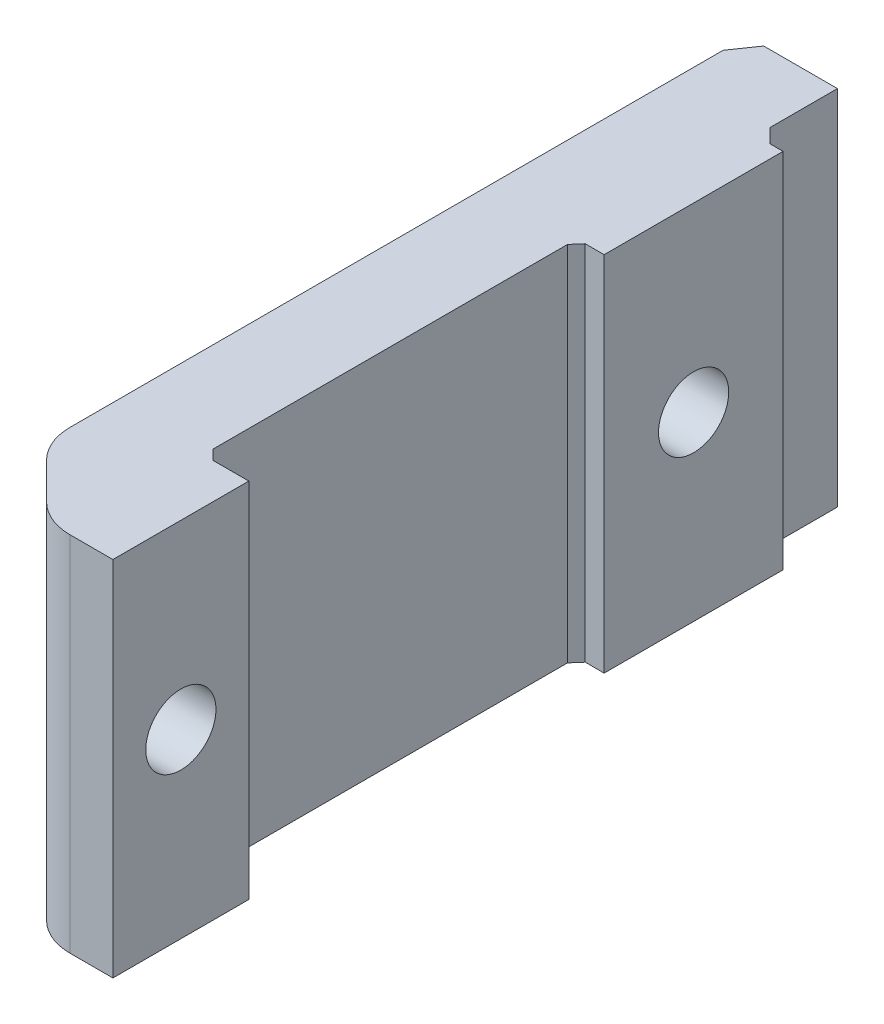
ISO-10303-21;
HEADER;
FILE_DESCRIPTION(('STEP AP214'),'2;1');
FILE_NAME('part.step','',(''),(''),'','','');
FILE_SCHEMA(('AUTOMOTIVE_DESIGN { 1 0 10303 214 1 1 1 1 }'));
ENDSEC;
DATA;
#1=APPLICATION_CONTEXT('core data for automotive mechanical design processes');
#2=APPLICATION_PROTOCOL_DEFINITION('international standard','automotive_design',2000,#1);
#3=PRODUCT_CONTEXT('',#1,'mechanical');
#4=PRODUCT('Part','Part','',(#3));
#5=PRODUCT_RELATED_PRODUCT_CATEGORY('part','',(#4));
#6=PRODUCT_DEFINITION_FORMATION('','',#4);
#7=PRODUCT_DEFINITION_CONTEXT('part definition',#1,'design');
#8=PRODUCT_DEFINITION('design','',#6,#7);
#9=PRODUCT_DEFINITION_SHAPE('','',#8);
#10=(LENGTH_UNIT() NAMED_UNIT(*) SI_UNIT(.MILLI.,.METRE.));
#11=(NAMED_UNIT(*) PLANE_ANGLE_UNIT() SI_UNIT($,.RADIAN.));
#12=(NAMED_UNIT(*) SI_UNIT($,.STERADIAN.) SOLID_ANGLE_UNIT());
#13=UNCERTAINTY_MEASURE_WITH_UNIT(LENGTH_MEASURE(1.E-05),#10,'distance_accuracy_value','');
#14=(GEOMETRIC_REPRESENTATION_CONTEXT(3) GLOBAL_UNCERTAINTY_ASSIGNED_CONTEXT((#13)) GLOBAL_UNIT_ASSIGNED_CONTEXT((#10,
#11,#12)) REPRESENTATION_CONTEXT('',''));
#15=CARTESIAN_POINT('',(0.,0.,0.));
#16=DIRECTION('',(0.,0.,1.));
#17=DIRECTION('',(1.,0.,0.));
#18=AXIS2_PLACEMENT_3D('',#15,#16,#17);
#19=CARTESIAN_POINT('',(-0.176864244741881,16.,3.99697087418127));
#20=DIRECTION('',(0.,-1.,0.));
#21=DIRECTION('',(0.,0.,-1.));
#22=AXIS2_PLACEMENT_3D('',#19,#20,#21);
#23=CYLINDRICAL_SURFACE('',#22,2.5);
#24=CARTESIAN_POINT('',(-2.63714928671423,8.,3.55312685625707));
#25=CARTESIAN_POINT('',(-2.63715455179953,7.91328528262915,3.55313134936422));
#26=CARTESIAN_POINT('',(-2.63850190324259,7.82649718349841,3.56043177872537));
#27=CARTESIAN_POINT('',(-2.64346503827495,7.65534506039806,3.58943311872725));
#28=CARTESIAN_POINT('',(-2.64708415723435,7.57098479172109,3.61115520570759));
#29=CARTESIAN_POINT('',(-2.65533723190511,7.40722009076834,3.66833668628013));
#30=CARTESIAN_POINT('',(-2.65996997230687,7.32780986876128,3.70377966764607));
#31=CARTESIAN_POINT('',(-2.66842184803655,7.17598969620337,3.78744471572229));
#32=CARTESIAN_POINT('',(-2.67224105346486,7.10357914280162,3.83566568057995));
#33=CARTESIAN_POINT('',(-2.67688973496471,6.96737987700647,3.94390282603817));
#34=CARTESIAN_POINT('',(-2.67770259997984,6.9036409367615,4.00398261488679));
#35=CARTESIAN_POINT('',(-2.6739528444265,6.78725865258344,4.13392506582161));
#36=CARTESIAN_POINT('',(-2.66939343883689,6.73460869478206,4.20378185492782));
#37=CARTESIAN_POINT('',(-2.653278232286,6.64468528703496,4.34659638258143));
#38=CARTESIAN_POINT('',(-2.64212930992112,6.60671487585939,4.41916025811655));
#39=CARTESIAN_POINT('',(-2.61197069557599,6.54308180535848,4.56793757943773));
#40=CARTESIAN_POINT('',(-2.59296468314763,6.5174133970193,4.64414930214883));
#41=CARTESIAN_POINT('',(-2.54820820858339,6.47972137957398,4.79215250402136));
#42=CARTESIAN_POINT('',(-2.52298175583215,6.46691337261618,4.86390611522359));
#43=CARTESIAN_POINT('',(-2.46560544897194,6.4514210654967,5.00569143598688));
#44=CARTESIAN_POINT('',(-2.43345417722126,6.44873884036075,5.07572278969351));
#45=CARTESIAN_POINT('',(-2.36113667132257,6.45243134532187,5.21577354737119));
#46=CARTESIAN_POINT('',(-2.32064542639852,6.45927470671808,5.28561038193112));
#47=CARTESIAN_POINT('',(-2.23382332039923,6.48122761164427,5.42011699716647));
#48=CARTESIAN_POINT('',(-2.18748959854607,6.49634121690236,5.48478422101388));
#49=CARTESIAN_POINT('',(-2.06315578751737,6.54333340622405,5.64219021543526));
#50=CARTESIAN_POINT('',(-1.98173709350291,6.57986071849479,5.73084681557743));
#51=CARTESIAN_POINT('',(-1.8100011631044,6.66352630637584,5.89353420707895));
#52=CARTESIAN_POINT('',(-1.71965652403016,6.71069786713301,5.96751772111174));
#53=CARTESIAN_POINT('',(-1.56291627536124,6.79446472892987,6.07899287614943));
#54=CARTESIAN_POINT('',(-1.4984255193106,6.82943078839074,6.12048054508538));
#55=CARTESIAN_POINT('',(-1.36643622736506,6.90074003026494,6.19714132233396));
#56=CARTESIAN_POINT('',(-1.29893551219178,6.93708420752134,6.23230975959076));
#57=CARTESIAN_POINT('',(-1.16097341571144,7.00956297040544,6.2963871043687));
#58=CARTESIAN_POINT('',(-1.090513508727,7.04569765043128,6.32529908581155));
#59=CARTESIAN_POINT('',(-0.946307508055552,7.11568460725738,6.37684821734745));
#60=CARTESIAN_POINT('',(-0.872565242341472,7.1495394327493,6.39949246543049));
#61=CARTESIAN_POINT('',(-0.728028447186261,7.20895895477479,6.43649204052778));
#62=CARTESIAN_POINT('',(-0.657582348345416,7.23499890769026,6.45141651884273));
#63=CARTESIAN_POINT('',(-0.513335310401748,7.27869098888067,6.4752934391704));
#64=CARTESIAN_POINT('',(-0.439552240226529,7.29638306644996,6.48427440916587));
#65=CARTESIAN_POINT('',(-0.300607137612723,7.31729829423222,6.49472522378213));
#66=CARTESIAN_POINT('',(-0.235799057201005,7.32228482770957,6.49711499460251));
#67=CARTESIAN_POINT('',(-0.106242422703102,7.32166518569311,6.49681309517796));
#68=CARTESIAN_POINT('',(-0.0414938780388344,7.31605755199565,6.49412072541647));
#69=CARTESIAN_POINT('',(0.107859810153625,7.29225719405487,6.48219058099686));
#70=CARTESIAN_POINT('',(0.191691048864391,7.2704192671506,6.47103080478403));
#71=CARTESIAN_POINT('',(0.35503014155456,7.21700191968655,6.44116177137173));
#72=CARTESIAN_POINT('',(0.434507279422327,7.18536172796506,6.42240518679231));
#73=CARTESIAN_POINT('',(0.584646140293019,7.1195587131712,6.37936576684948));
#74=CARTESIAN_POINT('',(0.655549708966023,7.08566864727152,6.35549122542122));
#75=CARTESIAN_POINT('',(0.794347269254775,7.01634321677795,6.30181145441928));
#76=CARTESIAN_POINT('',(0.86223881248401,6.98090663985665,6.27200150435516));
#77=CARTESIAN_POINT('',(0.995100834569794,6.91031649542325,6.20648902015249));
#78=CARTESIAN_POINT('',(1.06007610532625,6.875162547862,6.17079663924867));
#79=CARTESIAN_POINT('',(1.1871960806527,6.80643142612682,6.09336705738661));
#80=CARTESIAN_POINT('',(1.2493407720642,6.77285425928284,6.05162982833149));
#81=CARTESIAN_POINT('',(1.3981779164835,6.69384311531685,5.94152375883796));
#82=CARTESIAN_POINT('',(1.48317962869637,6.64996237006495,5.86967622374105));
#83=CARTESIAN_POINT('',(1.64499058479485,6.57218394283925,5.71263306397279));
#84=CARTESIAN_POINT('',(1.72181448497113,6.5382682026992,5.62746201839206));
#85=CARTESIAN_POINT('',(1.84834198594058,6.49116686584974,5.46548588451408));
#86=CARTESIAN_POINT('',(1.90021947498909,6.47500760598496,5.39126141047408));
#87=CARTESIAN_POINT('',(1.99617998203817,6.45376686443383,5.23638731915835));
#88=CARTESIAN_POINT('',(2.04026741100954,6.44867909514209,5.15574137568772));
#89=CARTESIAN_POINT('',(2.11955430297112,6.45192233858672,4.98944768840343));
#90=CARTESIAN_POINT('',(2.1546702779165,6.4603744281823,4.90376148811728));
#91=CARTESIAN_POINT('',(2.21448283262022,6.49263893737719,4.73163980072135));
#92=CARTESIAN_POINT('',(2.23918828730509,6.5164382295676,4.64520501620006));
#93=CARTESIAN_POINT('',(2.27559378917474,6.57520085898834,4.48792412728493));
#94=CARTESIAN_POINT('',(2.28864267178575,6.60809832938734,4.41660764306658));
#95=CARTESIAN_POINT('',(2.30813123330981,6.68480735170055,4.27913610641269));
#96=CARTESIAN_POINT('',(2.31457076940588,6.72861913942956,4.21298116553804));
#97=CARTESIAN_POINT('',(2.32218393364724,6.82497014443009,4.08930902827821));
#98=CARTESIAN_POINT('',(2.3234651744049,6.87730704307425,4.0316397680065));
#99=CARTESIAN_POINT('',(2.32266571000175,6.99000769576953,3.9248020459077));
#100=CARTESIAN_POINT('',(2.32058407620881,7.05037366276211,3.87563593631155));
#101=CARTESIAN_POINT('',(2.31447000919855,7.18257066455031,3.78355107347874));
#102=CARTESIAN_POINT('',(2.3103013774049,7.25492431648245,3.74139077823713));
#103=CARTESIAN_POINT('',(2.30182950161697,7.40546943588939,3.66924938751529));
#104=CARTESIAN_POINT('',(2.29752622752948,7.48366221393095,3.63927103600471));
#105=CARTESIAN_POINT('',(2.29011798692447,7.64747345201231,3.59123269171699));
#106=CARTESIAN_POINT('',(2.28707434882282,7.73326735234245,3.57375765285728));
#107=CARTESIAN_POINT('',(2.28350733033281,7.90661648983552,3.55348382306791));
#108=CARTESIAN_POINT('',(2.28298363032531,7.99417150221119,3.55068317089221));
#109=CARTESIAN_POINT('',(2.28461563090622,8.16734082170265,3.55978065331479));
#110=CARTESIAN_POINT('',(2.28673658980165,8.25296556144274,3.57148818802031));
#111=CARTESIAN_POINT('',(2.29290756182516,8.42102849088298,3.60892150697921));
#112=CARTESIAN_POINT('',(2.29695792590518,8.50346609790438,3.63464984168894));
#113=CARTESIAN_POINT('',(2.30559648736327,8.66328371010211,3.69954971816812));
#114=CARTESIAN_POINT('',(2.31018710229541,8.74063836590985,3.73878332563916));
#115=CARTESIAN_POINT('',(2.31794454880559,8.88780520768157,3.82963575835757));
#116=CARTESIAN_POINT('',(2.3211111905281,8.95761638694664,3.88125623371525));
#117=CARTESIAN_POINT('',(2.3237927251222,9.08801383495477,3.99574929065397));
#118=CARTESIAN_POINT('',(2.32329063021959,9.14855586285779,4.05867289888653));
#119=CARTESIAN_POINT('',(2.31630377451473,9.25807971948864,4.19358357912063));
#120=CARTESIAN_POINT('',(2.30982338187868,9.30706995595837,4.2655640004162));
#121=CARTESIAN_POINT('',(2.28964386326624,9.38919878992777,4.41092957434017));
#122=CARTESIAN_POINT('',(2.2764426910829,9.42316235431137,4.4839174893908));
#123=CARTESIAN_POINT('',(2.2421804870686,9.4789898721573,4.63260576969309));
#124=CARTESIAN_POINT('',(2.22112203619387,9.50085779294352,4.70830523688182));
#125=CARTESIAN_POINT('',(2.17236634126112,9.53180831345552,4.8553340406442));
#126=CARTESIAN_POINT('',(2.14509833394841,9.54152842043381,4.92667456606537));
#127=CARTESIAN_POINT('',(2.08383697775448,9.5511787867001,5.0670652941571));
#128=CARTESIAN_POINT('',(2.04984192349535,9.55110656034449,5.13611491086428));
#129=CARTESIAN_POINT('',(1.97321862984303,9.54210689228929,5.27521154140888));
#130=CARTESIAN_POINT('',(1.9301429050739,9.53253719160407,5.34496727640181));
#131=CARTESIAN_POINT('',(1.83824712070816,9.50532843916963,5.47884000990264));
#132=CARTESIAN_POINT('',(1.78942434059765,9.48768555427235,5.54295431259778));
#133=CARTESIAN_POINT('',(1.65713207087965,9.43385919082603,5.70060025967102));
#134=CARTESIAN_POINT('',(1.57006433625943,9.39286375872222,5.78947732377105));
#135=CARTESIAN_POINT('',(1.38683265786381,9.30061632783018,5.95143113373885));
#136=CARTESIAN_POINT('',(1.29063709408622,9.24932793429498,6.02444984264055));
#137=CARTESIAN_POINT('',(1.12699850513044,9.1610755247512,6.13139040474614));
#138=CARTESIAN_POINT('',(1.06168481332529,9.12560913089346,6.16991947142806));
#139=CARTESIAN_POINT('',(0.928093373429657,9.05391036960556,6.24080577499284));
#140=CARTESIAN_POINT('',(0.859813184404775,9.01767738447255,6.27315780644302));
#141=CARTESIAN_POINT('',(0.720280779386887,8.94619910555417,6.3316765581952));
#142=CARTESIAN_POINT('',(0.649032579038887,8.91095257862372,6.35785133563644));
#143=CARTESIAN_POINT('',(0.503086853620424,8.84381525285675,6.40394339284877));
#144=CARTESIAN_POINT('',(0.428394664534766,8.81191949823402,6.4238700028226));
#145=CARTESIAN_POINT('',(0.282934643708923,8.758234583528,6.45532731851368));
#146=CARTESIAN_POINT('',(0.212586380875185,8.73573354663375,6.46752279764581));
#147=CARTESIAN_POINT('',(0.0690032859084441,8.70061829921416,6.48589184736848));
#148=CARTESIAN_POINT('',(-0.00420894252811168,8.68793859246591,6.49210537898861));
#149=CARTESIAN_POINT('',(-0.153032770257191,8.67599476754823,6.4979741850727));
#150=CARTESIAN_POINT('',(-0.228662963988012,8.67690134180384,6.49754601357715));
#151=CARTESIAN_POINT('',(-0.378393635668834,8.69224318245107,6.48997414115978));
#152=CARTESIAN_POINT('',(-0.452485525621528,8.7067403635534,6.48279970583651));
#153=CARTESIAN_POINT('',(-0.57671827680571,8.7396571404344,6.46534689789265));
#154=CARTESIAN_POINT('',(-0.627723558618165,8.75581931160735,6.45651344740599));
#155=CARTESIAN_POINT('',(-0.727999642733378,8.7914387821591,6.43600019401252));
#156=CARTESIAN_POINT('',(-0.777269305035178,8.81089820024848,6.42431855881687));
#157=CARTESIAN_POINT('',(-0.923019920386962,8.87249352259133,6.38515646726799));
#158=CARTESIAN_POINT('',(-1.01709410414285,8.9177360712699,6.35361037098929));
#159=CARTESIAN_POINT('',(-1.17855797798075,8.99942899004714,6.28875714810822));
#160=CARTESIAN_POINT('',(-1.24704789659902,9.03546456097367,6.25758258626855));
#161=CARTESIAN_POINT('',(-1.38115104631696,9.1070893431979,6.18908688401362));
#162=CARTESIAN_POINT('',(-1.44676281479583,9.14267832113489,6.15176266324788));
#163=CARTESIAN_POINT('',(-1.63882080298436,9.24644183364527,6.03057008851518));
#164=CARTESIAN_POINT('',(-1.76110644150534,9.31195111631515,5.93723644588269));
#165=CARTESIAN_POINT('',(-1.94788417824021,9.40399689149441,5.76421084700346));
#166=CARTESIAN_POINT('',(-2.01697585440771,9.43597250817663,5.69232175134394));
#167=CARTESIAN_POINT('',(-2.14760033030577,9.489817174772,5.53850738203536));
#168=CARTESIAN_POINT('',(-2.20914283030737,9.51169929627452,5.45659526374465));
#169=CARTESIAN_POINT('',(-2.3127020339601,9.53926422630262,5.29907221337233));
#170=CARTESIAN_POINT('',(-2.35625192856219,9.54710783172076,5.22485683531669));
#171=CARTESIAN_POINT('',(-2.43555643443657,9.55156768313379,5.07200633149812));
#172=CARTESIAN_POINT('',(-2.47131574052475,9.54819071100063,4.99337390370785));
#173=CARTESIAN_POINT('',(-2.53426886544373,9.52852737254085,4.83366219489505));
#174=CARTESIAN_POINT('',(-2.56140680615498,9.51215910300892,4.75257053972781));
#175=CARTESIAN_POINT('',(-2.60650305437225,9.46561813520866,4.59179992887169));
#176=CARTESIAN_POINT('',(-2.62446424719875,9.43544978157508,4.51212053675951));
#177=CARTESIAN_POINT('',(-2.65048224009456,9.36562162176151,4.36594687705191));
#178=CARTESIAN_POINT('',(-2.65938904851121,9.32731198278262,4.29895146173425));
#179=CARTESIAN_POINT('',(-2.67162108160679,9.24086916255082,4.17108636421261));
#180=CARTESIAN_POINT('',(-2.67494599284704,9.19273542981858,4.11021702618489));
#181=CARTESIAN_POINT('',(-2.67754030874978,9.08682538979567,3.99517851681801));
#182=CARTESIAN_POINT('',(-2.67672672061132,9.02887446710486,3.94116890290625));
#183=CARTESIAN_POINT('',(-2.67258336088419,8.90546269634765,3.84261917641333));
#184=CARTESIAN_POINT('',(-2.66925201056391,8.83999715818738,3.79808502776773));
#185=CARTESIAN_POINT('',(-2.66143893475333,8.69771291416108,3.716424609568));
#186=CARTESIAN_POINT('',(-2.6568874559157,8.62040643825996,3.68015377301865));
#187=CARTESIAN_POINT('',(-2.64858584674796,8.46092156701254,3.62080653313048));
#188=CARTESIAN_POINT('',(-2.6448346990483,8.37874952860797,3.59771331526514));
#189=CARTESIAN_POINT('',(-2.64050954268608,8.24666535030124,3.57207703261483));
#190=CARTESIAN_POINT('',(-2.63926291565544,8.19761715892374,3.56497924667656));
#191=CARTESIAN_POINT('',(-2.63758128549682,8.09905396017267,3.55550288532631));
#192=CARTESIAN_POINT('',(-2.63714627884163,8.04953895482877,3.55312428940522));
#193=CARTESIAN_POINT('',(-2.63714928671423,8.,3.55312685625707));
#194=B_SPLINE_CURVE_WITH_KNOTS('',3,(#24,#25,#26,#27,#28,#29,#30,#31,#32,#33,#34,#35,#36,#37,
#38,#39,#40,#41,#42,#43,#44,#45,#46,#47,#48,#49,#50,#51,#52,#53,#54,#55,#56,#57,#58,#59,#60,#61,
#62,#63,#64,#65,#66,#67,#68,#69,#70,#71,#72,#73,#74,#75,#76,#77,#78,#79,#80,#81,#82,#83,#84,#85,
#86,#87,#88,#89,#90,#91,#92,#93,#94,#95,#96,#97,#98,#99,#100,#101,#102,#103,#104,#105,#106,#107,
#108,#109,#110,#111,#112,#113,#114,#115,#116,#117,#118,#119,#120,#121,#122,#123,#124,#125,#126,
#127,#128,#129,#130,#131,#132,#133,#134,#135,#136,#137,#138,#139,#140,#141,#142,#143,#144,#145,
#146,#147,#148,#149,#150,#151,#152,#153,#154,#155,#156,#157,#158,#159,#160,#161,#162,#163,#164,
#165,#166,#167,#168,#169,#170,#171,#172,#173,#174,#175,#176,#177,#178,#179,#180,#181,#182,#183,
#184,#185,#186,#187,#188,#189,#190,#191,#192,#193),.UNSPECIFIED.,.T.,.F.,(4,2,2,2,2,2,2,2,2,2,2,
2,2,2,2,2,2,2,2,2,2,2,2,2,2,2,2,2,2,2,2,2,2,2,2,2,2,2,2,2,2,2,2,2,2,2,2,2,2,2,2,2,2,2,2,2,2,2,2,
2,2,2,2,2,2,2,2,2,2,2,2,2,2,2,2,2,2,2,2,2,2,2,2,2,4),(0.,0.259959557600944,0.520301678940626,
0.780333349888979,1.04034260545439,1.30178637267187,1.56307376104617,1.80970183385275,
2.05621453893334,2.28656178082926,2.51695622406966,2.75909461357363,3.00135203030078,
3.37662391035488,3.75308596096088,4.00563803418962,4.25837602795112,4.51098956312534,
4.7633158407746,4.99253609624558,5.22064798996372,5.41476389639609,5.60890652330025,
5.86937921990535,6.13150022787713,6.37758493537446,6.62386614395025,6.86972663283107,
7.11558826452544,7.47327442301166,7.83030834222563,8.10523331186111,8.38000210818563,
8.65724170269237,8.93424447106099,9.17190228316004,9.40956523054051,9.64224351771494,
9.87498606820603,10.1254115469431,10.3758934025225,10.6374396019118,10.8989526269255,
11.1570661797426,11.4152267004358,11.6745898397832,11.9339875492591,12.194587136464,
12.4549964619058,12.6984353676694,12.9417943790014,13.1717577403224,13.4017794746595,
13.6484943122814,13.8953264118561,14.2861331539039,14.6783468946827,14.9292349929606,
15.1803335922289,15.4311028448055,15.681495827859,15.9054248949238,16.1278474563225,
16.3530667603552,16.5793171076701,16.741794223959,16.9043761417967,17.2306364318654,
17.4806872536758,17.7308637082993,18.2290064171271,18.5421824889704,18.8549518352414,
19.1131307710921,19.3711536884231,19.6308163491683,19.8903973173819,20.1223793982302,
20.3543745050663,20.5910401243554,20.8278542651388,21.0832498280305,21.3383187754798,
21.4868308290173,21.6353422371352),.UNSPECIFIED.);
#195=CARTESIAN_POINT('',(-2.67686424474188,6.91421966157149,3.99697087418127));
#196=VERTEX_POINT('',#195);
#197=CARTESIAN_POINT('',(-1.94463119770825,6.59829713448347,5.76473782714764));
#198=VERTEX_POINT('',#197);
#199=EDGE_CURVE('E308',#196,#198,#194,.T.);
#200=ORIENTED_EDGE('',*,*,#199,.F.);
#201=DIRECTION('',(0.,-1.,0.));
#202=VECTOR('',#201,1.);
#203=CARTESIAN_POINT('',(-2.67686424474188,16.,3.99697087418127));
#204=LINE('',#203,#202);
#205=CARTESIAN_POINT('',(-2.67686424474188,0.,3.99697087418127));
#206=VERTEX_POINT('',#205);
#207=EDGE_CURVE('E127',#196,#206,#204,.T.);
#208=ORIENTED_EDGE('',*,*,#207,.T.);
#209=CARTESIAN_POINT('',(-0.176864244741881,0.,3.99697087418127));
#210=DIRECTION('',(0.,1.,0.));
#211=DIRECTION('',(0.,0.,1.));
#212=AXIS2_PLACEMENT_3D('',#209,#210,#211);
#213=CIRCLE('',#212,2.5);
#214=CARTESIAN_POINT('',(-1.94463119770825,0.,5.76473782714764));
#215=VERTEX_POINT('',#214);
#216=EDGE_CURVE('E211',#215,#206,#213,.F.);
#217=ORIENTED_EDGE('',*,*,#216,.F.);
#218=DIRECTION('',(0.,-1.,0.));
#219=VECTOR('',#218,1.);
#220=CARTESIAN_POINT('',(-1.94463119770825,16.,5.76473782714764));
#221=LINE('',#220,#219);
#222=EDGE_CURVE('E292',#198,#215,#221,.T.);
#223=ORIENTED_EDGE('',*,*,#222,.F.);
#224=EDGE_LOOP('',(#200,#208,#217,#223));
#225=FACE_BOUND('',#224,.T.);
#226=ADVANCED_FACE('F38',(#225),#23,.T.);
#227=CARTESIAN_POINT('',(-1.94463119770831,9.40170286551665,5.76473782714774));
#228=VERTEX_POINT('',#227);
#229=CARTESIAN_POINT('',(-2.67686424474188,9.08578033842851,3.99697087418127));
#230=VERTEX_POINT('',#229);
#231=EDGE_CURVE('E54',#228,#230,#194,.T.);
#232=ORIENTED_EDGE('',*,*,#231,.F.);
#233=CARTESIAN_POINT('',(-1.94463119770825,16.,5.76473782714764));
#234=VERTEX_POINT('',#233);
#235=EDGE_CURVE('E48',#234,#228,#221,.T.);
#236=ORIENTED_EDGE('',*,*,#235,.F.);
#237=CARTESIAN_POINT('',(-0.176864244741881,16.,3.99697087418127));
#238=DIRECTION('',(0.,1.,0.));
#239=DIRECTION('',(0.,0.,1.));
#240=AXIS2_PLACEMENT_3D('',#237,#238,#239);
#241=CIRCLE('',#240,2.5);
#242=CARTESIAN_POINT('',(-2.67686424474188,16.,3.99697087418127));
#243=VERTEX_POINT('',#242);
#244=EDGE_CURVE('E256',#234,#243,#241,.F.);
#245=ORIENTED_EDGE('',*,*,#244,.T.);
#246=EDGE_CURVE('E62',#243,#230,#204,.T.);
#247=ORIENTED_EDGE('',*,*,#246,.T.);
#248=EDGE_LOOP('',(#232,#236,#245,#247));
#249=FACE_BOUND('',#248,.T.);
#250=ADVANCED_FACE('F40',(#249),#23,.T.);
#251=CARTESIAN_POINT('',(-3.85468451242794,16.,3.85468451242795));
#252=DIRECTION('',(0.707106781186547,0.,-0.707106781186548));
#253=DIRECTION('',(-0.707106781186548,0.,-0.707106781186547));
#254=AXIS2_PLACEMENT_3D('',#251,#252,#253);
#255=PLANE('',#254);
#256=ORIENTED_EDGE('',*,*,#235,.T.);
#257=CARTESIAN_POINT('',(-2.60624216859882,8.,5.10312685625707));
#258=DIRECTION('',(0.707106781186547,0.,-0.707106781186548));
#259=DIRECTION('',(0.707106781186548,0.,0.707106781186547));
#260=AXIS2_PLACEMENT_3D('',#257,#258,#259);
#261=ELLIPSE('',#260,2.1920310216783,1.55);
#262=EDGE_CURVE('E300',#228,#198,#261,.T.);
#263=ORIENTED_EDGE('',*,*,#262,.T.);
#264=ORIENTED_EDGE('',*,*,#222,.T.);
#265=DIRECTION('',(0.707106781186548,0.,0.707106781186547));
#266=VECTOR('',#265,1.);
#267=CARTESIAN_POINT('',(-3.85468451242794,0.,3.85468451242795));
#268=LINE('',#267,#266);
#269=CARTESIAN_POINT('',(-0.338475215632805,0.,7.37089380922308));
#270=VERTEX_POINT('',#269);
#271=EDGE_CURVE('E213',#215,#270,#268,.T.);
#272=ORIENTED_EDGE('',*,*,#271,.T.);
#273=DIRECTION('',(0.,-1.,0.));
#274=VECTOR('',#273,1.);
#275=CARTESIAN_POINT('',(-0.338475215632805,16.,7.37089380922308));
#276=LINE('',#275,#274);
#277=CARTESIAN_POINT('',(-0.338475215632805,16.,7.37089380922308));
#278=VERTEX_POINT('',#277);
#279=EDGE_CURVE('E290',#278,#270,#276,.T.);
#280=ORIENTED_EDGE('',*,*,#279,.F.);
#281=DIRECTION('',(0.707106781186548,0.,0.707106781186547));
#282=VECTOR('',#281,1.);
#283=CARTESIAN_POINT('',(-3.85468451242794,16.,3.85468451242795));
#284=LINE('',#283,#282);
#285=EDGE_CURVE('E402',#234,#278,#284,.T.);
#286=ORIENTED_EDGE('',*,*,#285,.F.);
#287=EDGE_LOOP('',(#256,#263,#264,#272,#280,#286));
#288=FACE_BOUND('',#287,.T.);
#289=ADVANCED_FACE('F298',(#288),#255,.F.);
#290=CARTESIAN_POINT('',(1.42929173733356,16.,5.60312685625671));
#291=DIRECTION('',(0.,-1.,0.));
#292=DIRECTION('',(0.,0.,-1.));
#293=AXIS2_PLACEMENT_3D('',#290,#291,#292);
#294=CYLINDRICAL_SURFACE('',#293,2.5);
#295=CARTESIAN_POINT('',(1.42929173733356,0.,5.60312685625671));
#296=DIRECTION('',(0.,1.,0.));
#297=DIRECTION('',(0.,0.,1.));
#298=AXIS2_PLACEMENT_3D('',#295,#296,#297);
#299=CIRCLE('',#298,2.5);
#300=CARTESIAN_POINT('',(1.42929173733356,0.,8.10312685625671));
#301=VERTEX_POINT('',#300);
#302=EDGE_CURVE('E217',#301,#270,#299,.F.);
#303=ORIENTED_EDGE('',*,*,#302,.F.);
#304=DIRECTION('',(0.,-1.,0.));
#305=VECTOR('',#304,1.);
#306=CARTESIAN_POINT('',(1.42929173733356,16.,8.10312685625671));
#307=LINE('',#306,#305);
#308=CARTESIAN_POINT('',(1.42929173733356,16.,8.10312685625671));
#309=VERTEX_POINT('',#308);
#310=EDGE_CURVE('E288',#309,#301,#307,.T.);
#311=ORIENTED_EDGE('',*,*,#310,.F.);
#312=CARTESIAN_POINT('',(1.42929173733356,16.,5.60312685625671));
#313=DIRECTION('',(0.,1.,0.));
#314=DIRECTION('',(0.,0.,1.));
#315=AXIS2_PLACEMENT_3D('',#312,#313,#314);
#316=CIRCLE('',#315,2.5);
#317=EDGE_CURVE('E401',#309,#278,#316,.F.);
#318=ORIENTED_EDGE('',*,*,#317,.T.);
#319=ORIENTED_EDGE('',*,*,#279,.T.);
#320=EDGE_LOOP('',(#303,#311,#318,#319));
#321=FACE_BOUND('',#320,.T.);
#322=ADVANCED_FACE('F316',(#321),#294,.T.);
#323=CARTESIAN_POINT('',(-1.52157214212552E-12,16.,8.10312685625644));
#324=DIRECTION('',(1.87775925160385E-13,0.,-1.));
#325=DIRECTION('',(-1.,0.,-1.87775925160385E-13));
#326=AXIS2_PLACEMENT_3D('',#323,#324,#325);
#327=PLANE('',#326);
#328=DIRECTION('',(1.,0.,1.87775925160385E-13));
#329=VECTOR('',#328,1.);
#330=CARTESIAN_POINT('',(-1.52157214212552E-12,0.,8.10312685625644));
#331=LINE('',#330,#329);
#332=CARTESIAN_POINT('',(3.32313575525812,0.,8.10312685625707));
#333=VERTEX_POINT('',#332);
#334=EDGE_CURVE('E220',#301,#333,#331,.T.);
#335=ORIENTED_EDGE('',*,*,#334,.T.);
#336=DIRECTION('',(0.,-1.,0.));
#337=VECTOR('',#336,1.);
#338=CARTESIAN_POINT('',(3.32313575525812,16.,8.10312685625707));
#339=LINE('',#338,#337);
#340=CARTESIAN_POINT('',(3.32313575525812,16.,8.10312685625707));
#341=VERTEX_POINT('',#340);
#342=EDGE_CURVE('E285',#341,#333,#339,.T.);
#343=ORIENTED_EDGE('',*,*,#342,.F.);
#344=DIRECTION('',(1.,0.,1.87775925160385E-13));
#345=VECTOR('',#344,1.);
#346=CARTESIAN_POINT('',(-1.52157214212552E-12,16.,8.10312685625644));
#347=LINE('',#346,#345);
#348=EDGE_CURVE('E407',#309,#341,#347,.T.);
#349=ORIENTED_EDGE('',*,*,#348,.F.);
#350=ORIENTED_EDGE('',*,*,#310,.T.);
#351=EDGE_LOOP('',(#335,#343,#349,#350));
#352=FACE_BOUND('',#351,.T.);
#353=ADVANCED_FACE('F389',(#352),#327,.F.);
#354=CARTESIAN_POINT('',(3.32313575525812,16.,0.));
#355=DIRECTION('',(-1.,0.,0.));
#356=DIRECTION('',(0.,0.,1.));
#357=AXIS2_PLACEMENT_3D('',#354,#355,#356);
#358=PLANE('',#357);
#359=CARTESIAN_POINT('',(3.32313575525812,8.,5.10312685625707));
#360=DIRECTION('',(1.,0.,0.));
#361=DIRECTION('',(0.,0.,-1.));
#362=AXIS2_PLACEMENT_3D('',#359,#360,#361);
#363=CIRCLE('',#362,1.55);
#364=CARTESIAN_POINT('',(3.32313575525812,8.,3.55312685625707));
#365=VERTEX_POINT('',#364);
#366=EDGE_CURVE('E317',#365,#365,#363,.T.);
#367=ORIENTED_EDGE('',*,*,#366,.F.);
#368=EDGE_LOOP('',(#367));
#369=FACE_BOUND('',#368,.T.);
#370=DIRECTION('',(0.,0.,-1.));
#371=VECTOR('',#370,1.);
#372=CARTESIAN_POINT('',(3.32313575525812,0.,0.));
#373=LINE('',#372,#371);
#374=CARTESIAN_POINT('',(3.32313575525812,0.,2.10312685625707));
#375=VERTEX_POINT('',#374);
#376=EDGE_CURVE('E222',#333,#375,#373,.T.);
#377=ORIENTED_EDGE('',*,*,#376,.T.);
#378=DIRECTION('',(0.,-1.,0.));
#379=VECTOR('',#378,1.);
#380=CARTESIAN_POINT('',(3.32313575525812,16.,2.10312685625707));
#381=LINE('',#380,#379);
#382=CARTESIAN_POINT('',(3.32313575525812,16.,2.10312685625707));
#383=VERTEX_POINT('',#382);
#384=EDGE_CURVE('E282',#383,#375,#381,.T.);
#385=ORIENTED_EDGE('',*,*,#384,.F.);
#386=DIRECTION('',(0.,0.,-1.));
#387=VECTOR('',#386,1.);
#388=CARTESIAN_POINT('',(3.32313575525812,16.,0.));
#389=LINE('',#388,#387);
#390=EDGE_CURVE('E409',#341,#383,#389,.T.);
#391=ORIENTED_EDGE('',*,*,#390,.F.);
#392=ORIENTED_EDGE('',*,*,#342,.T.);
#393=EDGE_LOOP('',(#377,#385,#391,#392));
#394=FACE_BOUND('',#393,.T.);
#395=ADVANCED_FACE('F385',(#369,#394),#358,.F.);
#396=CARTESIAN_POINT('',(-4.75827272946578E-13,16.,2.10312685625632));
#397=DIRECTION('',(-2.26247537817846E-13,0.,1.));
#398=DIRECTION('',(1.,0.,2.26247537817846E-13));
#399=AXIS2_PLACEMENT_3D('',#396,#397,#398);
#400=PLANE('',#399);
#401=DIRECTION('',(-1.,0.,-2.26247537817846E-13));
#402=VECTOR('',#401,1.);
#403=CARTESIAN_POINT('',(-4.75827272946578E-13,0.,2.10312685625632));
#404=LINE('',#403,#402);
#405=CARTESIAN_POINT('',(1.75132500317137,0.,2.10312685625671));
#406=VERTEX_POINT('',#405);
#407=EDGE_CURVE('E224',#375,#406,#404,.T.);
#408=ORIENTED_EDGE('',*,*,#407,.T.);
#409=DIRECTION('',(0.,-1.,0.));
#410=VECTOR('',#409,1.);
#411=CARTESIAN_POINT('',(1.75132500317137,16.,2.10312685625671));
#412=LINE('',#411,#410);
#413=CARTESIAN_POINT('',(1.75132500317137,16.,2.10312685625671));
#414=VERTEX_POINT('',#413);
#415=EDGE_CURVE('E279',#414,#406,#412,.T.);
#416=ORIENTED_EDGE('',*,*,#415,.F.);
#417=DIRECTION('',(-1.,0.,-2.26247537817846E-13));
#418=VECTOR('',#417,1.);
#419=CARTESIAN_POINT('',(-4.75827272946578E-13,16.,2.10312685625632));
#420=LINE('',#419,#418);
#421=EDGE_CURVE('E411',#383,#414,#420,.T.);
#422=ORIENTED_EDGE('',*,*,#421,.F.);
#423=ORIENTED_EDGE('',*,*,#384,.T.);
#424=EDGE_LOOP('',(#408,#416,#422,#423));
#425=FACE_BOUND('',#424,.T.);
#426=ADVANCED_FACE('F381',(#425),#400,.F.);
#427=CARTESIAN_POINT('',(-0.175900926542672,16.,0.175900926542672));
#428=DIRECTION('',(-0.707106781186548,0.,0.707106781186547));
#429=DIRECTION('',(0.707106781186547,0.,0.707106781186548));
#430=AXIS2_PLACEMENT_3D('',#427,#428,#429);
#431=PLANE('',#430);
#432=DIRECTION('',(-0.707106781186547,0.,-0.707106781186548));
#433=VECTOR('',#432,1.);
#434=CARTESIAN_POINT('',(-0.175900926542672,0.,0.175900926542672));
#435=LINE('',#434,#433);
#436=CARTESIAN_POINT('',(1.31103643876958,0.,1.66283829185492));
#437=VERTEX_POINT('',#436);
#438=EDGE_CURVE('E226',#406,#437,#435,.T.);
#439=ORIENTED_EDGE('',*,*,#438,.T.);
#440=DIRECTION('',(0.,-1.,0.));
#441=VECTOR('',#440,1.);
#442=CARTESIAN_POINT('',(1.31103643876958,16.,1.66283829185492));
#443=LINE('',#442,#441);
#444=CARTESIAN_POINT('',(1.31103643876958,16.,1.66283829185492));
#445=VERTEX_POINT('',#444);
#446=EDGE_CURVE('E276',#445,#437,#443,.T.);
#447=ORIENTED_EDGE('',*,*,#446,.F.);
#448=DIRECTION('',(-0.707106781186547,0.,-0.707106781186548));
#449=VECTOR('',#448,1.);
#450=CARTESIAN_POINT('',(-0.175900926542672,16.,0.175900926542672));
#451=LINE('',#450,#449);
#452=EDGE_CURVE('E413',#414,#445,#451,.T.);
#453=ORIENTED_EDGE('',*,*,#452,.F.);
#454=ORIENTED_EDGE('',*,*,#415,.T.);
#455=EDGE_LOOP('',(#439,#447,#453,#454));
#456=FACE_BOUND('',#455,.T.);
#457=ADVANCED_FACE('F377',(#456),#431,.F.);
#458=CARTESIAN_POINT('',(1.31103643876958,16.,0.));
#459=DIRECTION('',(-1.,0.,0.));
#460=DIRECTION('',(0.,0.,1.));
#461=AXIS2_PLACEMENT_3D('',#458,#459,#460);
#462=PLANE('',#461);
#463=DIRECTION('',(0.,0.,-1.));
#464=VECTOR('',#463,1.);
#465=CARTESIAN_POINT('',(1.31103643876958,0.,0.));
#466=LINE('',#465,#464);
#467=CARTESIAN_POINT('',(1.31103643876958,0.,-13.978392046476));
#468=VERTEX_POINT('',#467);
#469=EDGE_CURVE('E228',#437,#468,#466,.T.);
#470=ORIENTED_EDGE('',*,*,#469,.T.);
#471=DIRECTION('',(0.,-1.,0.));
#472=VECTOR('',#471,1.);
#473=CARTESIAN_POINT('',(1.31103643876958,16.,-13.978392046476));
#474=LINE('',#473,#472);
#475=CARTESIAN_POINT('',(1.31103643876958,16.,-13.978392046476));
#476=VERTEX_POINT('',#475);
#477=EDGE_CURVE('E273',#476,#468,#474,.T.);
#478=ORIENTED_EDGE('',*,*,#477,.F.);
#479=DIRECTION('',(0.,0.,-1.));
#480=VECTOR('',#479,1.);
#481=CARTESIAN_POINT('',(1.31103643876958,16.,0.));
#482=LINE('',#481,#480);
#483=EDGE_CURVE('E415',#445,#476,#482,.T.);
#484=ORIENTED_EDGE('',*,*,#483,.F.);
#485=ORIENTED_EDGE('',*,*,#446,.T.);
#486=EDGE_LOOP('',(#470,#478,#484,#485));
#487=FACE_BOUND('',#486,.T.);
#488=ADVANCED_FACE('F373',(#487),#462,.F.);
#489=CARTESIAN_POINT('',(-6.17082235697596,16.,-5.35223557083783));
#490=DIRECTION('',(-0.755435187429416,0.,-0.655223379919767));
#491=DIRECTION('',(-0.655223379919767,0.,0.755435187429416));
#492=AXIS2_PLACEMENT_3D('',#489,#490,#491);
#493=PLANE('',#492);
#494=DIRECTION('',(0.655223379919767,0.,-0.755435187429416));
#495=VECTOR('',#494,1.);
#496=CARTESIAN_POINT('',(-6.17082235697596,0.,-5.35223557083783));
#497=LINE('',#496,#495);
#498=CARTESIAN_POINT('',(1.67400417385354,0.,-14.3968731437433));
#499=VERTEX_POINT('',#498);
#500=EDGE_CURVE('E230',#468,#499,#497,.T.);
#501=ORIENTED_EDGE('',*,*,#500,.T.);
#502=DIRECTION('',(0.,-1.,0.));
#503=VECTOR('',#502,1.);
#504=CARTESIAN_POINT('',(1.67400417385354,16.,-14.3968731437433));
#505=LINE('',#504,#503);
#506=CARTESIAN_POINT('',(1.67400417385354,16.,-14.3968731437433));
#507=VERTEX_POINT('',#506);
#508=EDGE_CURVE('E271',#507,#499,#505,.T.);
#509=ORIENTED_EDGE('',*,*,#508,.F.);
#510=DIRECTION('',(0.655223379919767,0.,-0.755435187429416));
#511=VECTOR('',#510,1.);
#512=CARTESIAN_POINT('',(-6.17082235697596,16.,-5.35223557083783));
#513=LINE('',#512,#511);
#514=EDGE_CURVE('E417',#476,#507,#513,.T.);
#515=ORIENTED_EDGE('',*,*,#514,.F.);
#516=ORIENTED_EDGE('',*,*,#477,.T.);
#517=EDGE_LOOP('',(#501,#509,#515,#516));
#518=FACE_BOUND('',#517,.T.);
#519=ADVANCED_FACE('F369',(#518),#493,.F.);
#520=CARTESIAN_POINT('',(0.,16.,-14.3968731437433));
#521=DIRECTION('',(0.,0.,1.));
#522=DIRECTION('',(1.,0.,0.));
#523=AXIS2_PLACEMENT_3D('',#520,#521,#522);
#524=PLANE('',#523);
#525=DIRECTION('',(-1.,0.,0.));
#526=VECTOR('',#525,1.);
#527=CARTESIAN_POINT('',(0.,0.,-14.3968731437433));
#528=LINE('',#527,#526);
#529=CARTESIAN_POINT('',(2.51103643876979,0.,-14.3968731437433));
#530=VERTEX_POINT('',#529);
#531=EDGE_CURVE('E233',#530,#499,#528,.T.);
#532=ORIENTED_EDGE('',*,*,#531,.F.);
#533=DIRECTION('',(0.,-1.,0.));
#534=VECTOR('',#533,1.);
#535=CARTESIAN_POINT('',(2.51103643876979,16.,-14.3968731437433));
#536=LINE('',#535,#534);
#537=CARTESIAN_POINT('',(2.51103643876979,16.,-14.3968731437433));
#538=VERTEX_POINT('',#537);
#539=EDGE_CURVE('E269',#538,#530,#536,.T.);
#540=ORIENTED_EDGE('',*,*,#539,.F.);
#541=DIRECTION('',(-1.,0.,0.));
#542=VECTOR('',#541,1.);
#543=CARTESIAN_POINT('',(0.,16.,-14.3968731437433));
#544=LINE('',#543,#542);
#545=EDGE_CURVE('E419',#538,#507,#544,.T.);
#546=ORIENTED_EDGE('',*,*,#545,.T.);
#547=ORIENTED_EDGE('',*,*,#508,.T.);
#548=EDGE_LOOP('',(#532,#540,#546,#547));
#549=FACE_BOUND('',#548,.T.);
#550=ADVANCED_FACE('F365',(#549),#524,.T.);
#551=CARTESIAN_POINT('',(2.51103643876979,16.,0.));
#552=DIRECTION('',(-1.,0.,0.));
#553=DIRECTION('',(0.,0.,1.));
#554=AXIS2_PLACEMENT_3D('',#551,#552,#553);
#555=PLANE('',#554);
#556=CARTESIAN_POINT('',(2.51103643876979,8.,-18.3468731437433));
#557=DIRECTION('',(-1.,0.,0.));
#558=DIRECTION('',(0.,0.,1.));
#559=AXIS2_PLACEMENT_3D('',#556,#557,#558);
#560=CIRCLE('',#559,1.55);
#561=CARTESIAN_POINT('',(2.51103643876979,8.,-16.7968731437433));
#562=VERTEX_POINT('',#561);
#563=EDGE_CURVE('E214',#562,#562,#560,.T.);
#564=ORIENTED_EDGE('',*,*,#563,.T.);
#565=EDGE_LOOP('',(#564));
#566=FACE_BOUND('',#565,.T.);
#567=DIRECTION('',(0.,0.,-1.));
#568=VECTOR('',#567,1.);
#569=CARTESIAN_POINT('',(2.51103643876979,0.,0.));
#570=LINE('',#569,#568);
#571=CARTESIAN_POINT('',(2.51103643876979,0.,-22.2968731437433));
#572=VERTEX_POINT('',#571);
#573=EDGE_CURVE('E236',#530,#572,#570,.T.);
#574=ORIENTED_EDGE('',*,*,#573,.T.);
#575=DIRECTION('',(0.,-1.,0.));
#576=VECTOR('',#575,1.);
#577=CARTESIAN_POINT('',(2.51103643876979,16.,-22.2968731437433));
#578=LINE('',#577,#576);
#579=CARTESIAN_POINT('',(2.51103643876979,16.,-22.2968731437433));
#580=VERTEX_POINT('',#579);
#581=EDGE_CURVE('E267',#580,#572,#578,.T.);
#582=ORIENTED_EDGE('',*,*,#581,.F.);
#583=DIRECTION('',(0.,0.,-1.));
#584=VECTOR('',#583,1.);
#585=CARTESIAN_POINT('',(2.51103643876979,16.,0.));
#586=LINE('',#585,#584);
#587=EDGE_CURVE('E422',#538,#580,#586,.T.);
#588=ORIENTED_EDGE('',*,*,#587,.F.);
#589=ORIENTED_EDGE('',*,*,#539,.T.);
#590=EDGE_LOOP('',(#574,#582,#588,#589));
#591=FACE_BOUND('',#590,.T.);
#592=ADVANCED_FACE('F361',(#566,#591),#555,.F.);
#593=CARTESIAN_POINT('',(0.,16.,-22.2968731437433));
#594=DIRECTION('',(0.,0.,-1.));
#595=DIRECTION('',(-1.,0.,0.));
#596=AXIS2_PLACEMENT_3D('',#593,#594,#595);
#597=PLANE('',#596);
#598=DIRECTION('',(1.,0.,0.));
#599=VECTOR('',#598,1.);
#600=CARTESIAN_POINT('',(0.,0.,-22.2968731437433));
#601=LINE('',#600,#599);
#602=CARTESIAN_POINT('',(1.93694176866518,0.,-22.2968731437433));
#603=VERTEX_POINT('',#602);
#604=EDGE_CURVE('E239',#603,#572,#601,.T.);
#605=ORIENTED_EDGE('',*,*,#604,.F.);
#606=DIRECTION('',(0.,-1.,0.));
#607=VECTOR('',#606,1.);
#608=CARTESIAN_POINT('',(1.93694176866518,16.,-22.2968731437433));
#609=LINE('',#608,#607);
#610=CARTESIAN_POINT('',(1.93694176866518,16.,-22.2968731437433));
#611=VERTEX_POINT('',#610);
#612=EDGE_CURVE('E265',#611,#603,#609,.T.);
#613=ORIENTED_EDGE('',*,*,#612,.F.);
#614=DIRECTION('',(1.,0.,0.));
#615=VECTOR('',#614,1.);
#616=CARTESIAN_POINT('',(0.,16.,-22.2968731437433));
#617=LINE('',#616,#615);
#618=EDGE_CURVE('E424',#611,#580,#617,.T.);
#619=ORIENTED_EDGE('',*,*,#618,.T.);
#620=ORIENTED_EDGE('',*,*,#581,.T.);
#621=EDGE_LOOP('',(#605,#613,#619,#620));
#622=FACE_BOUND('',#621,.T.);
#623=ADVANCED_FACE('F357',(#622),#597,.T.);
#624=CARTESIAN_POINT('',(12.1169074562048,16.,-12.1169074561978));
#625=DIRECTION('',(0.707106781186752,0.,-0.707106781186343));
#626=DIRECTION('',(-0.707106781186343,0.,-0.707106781186752));
#627=AXIS2_PLACEMENT_3D('',#624,#625,#626);
#628=PLANE('',#627);
#629=DIRECTION('',(0.707106781186343,0.,0.707106781186752));
#630=VECTOR('',#629,1.);
#631=CARTESIAN_POINT('',(12.1169074562048,0.,-12.1169074561978));
#632=LINE('',#631,#630);
#633=CARTESIAN_POINT('',(1.31103643876979,0.,-22.922778473639));
#634=VERTEX_POINT('',#633);
#635=EDGE_CURVE('E242',#634,#603,#632,.T.);
#636=ORIENTED_EDGE('',*,*,#635,.F.);
#637=DIRECTION('',(0.,-1.,0.));
#638=VECTOR('',#637,1.);
#639=CARTESIAN_POINT('',(1.31103643876979,16.,-22.922778473639));
#640=LINE('',#639,#638);
#641=CARTESIAN_POINT('',(1.31103643876979,16.,-22.922778473639));
#642=VERTEX_POINT('',#641);
#643=EDGE_CURVE('E263',#642,#634,#640,.T.);
#644=ORIENTED_EDGE('',*,*,#643,.F.);
#645=DIRECTION('',(0.707106781186343,0.,0.707106781186752));
#646=VECTOR('',#645,1.);
#647=CARTESIAN_POINT('',(12.1169074562048,16.,-12.1169074561978));
#648=LINE('',#647,#646);
#649=EDGE_CURVE('E427',#642,#611,#648,.T.);
#650=ORIENTED_EDGE('',*,*,#649,.T.);
#651=ORIENTED_EDGE('',*,*,#612,.T.);
#652=EDGE_LOOP('',(#636,#644,#650,#651));
#653=FACE_BOUND('',#652,.T.);
#654=ADVANCED_FACE('F353',(#653),#628,.T.);
#655=CARTESIAN_POINT('',(1.31103643876979,16.,0.));
#656=DIRECTION('',(-1.,0.,0.));
#657=DIRECTION('',(0.,0.,1.));
#658=AXIS2_PLACEMENT_3D('',#655,#656,#657);
#659=PLANE('',#658);
#660=DIRECTION('',(0.,0.,-1.));
#661=VECTOR('',#660,1.);
#662=CARTESIAN_POINT('',(1.31103643876979,0.,0.));
#663=LINE('',#662,#661);
#664=CARTESIAN_POINT('',(1.31103643876979,0.,-25.8968731437433));
#665=VERTEX_POINT('',#664);
#666=EDGE_CURVE('E245',#634,#665,#663,.T.);
#667=ORIENTED_EDGE('',*,*,#666,.T.);
#668=DIRECTION('',(0.,-1.,0.));
#669=VECTOR('',#668,1.);
#670=CARTESIAN_POINT('',(1.31103643876979,16.,-25.8968731437433));
#671=LINE('',#670,#669);
#672=CARTESIAN_POINT('',(1.31103643876979,16.,-25.8968731437433));
#673=VERTEX_POINT('',#672);
#674=EDGE_CURVE('E260',#673,#665,#671,.T.);
#675=ORIENTED_EDGE('',*,*,#674,.F.);
#676=DIRECTION('',(0.,0.,-1.));
#677=VECTOR('',#676,1.);
#678=CARTESIAN_POINT('',(1.31103643876979,16.,0.));
#679=LINE('',#678,#677);
#680=EDGE_CURVE('E430',#642,#673,#679,.T.);
#681=ORIENTED_EDGE('',*,*,#680,.F.);
#682=ORIENTED_EDGE('',*,*,#643,.T.);
#683=EDGE_LOOP('',(#667,#675,#681,#682));
#684=FACE_BOUND('',#683,.T.);
#685=ADVANCED_FACE('F349',(#684),#659,.F.);
#686=CARTESIAN_POINT('',(0.,16.,-25.8968731437433));
#687=DIRECTION('',(0.,0.,1.));
#688=DIRECTION('',(1.,0.,0.));
#689=AXIS2_PLACEMENT_3D('',#686,#687,#688);
#690=PLANE('',#689);
#691=DIRECTION('',(-1.,0.,0.));
#692=VECTOR('',#691,1.);
#693=CARTESIAN_POINT('',(0.,0.,-25.8968731437433));
#694=LINE('',#693,#692);
#695=CARTESIAN_POINT('',(-1.94463119770113,0.,-25.8968731437433));
#696=VERTEX_POINT('',#695);
#697=EDGE_CURVE('E247',#665,#696,#694,.T.);
#698=ORIENTED_EDGE('',*,*,#697,.T.);
#699=DIRECTION('',(0.,-1.,0.));
#700=VECTOR('',#699,1.);
#701=CARTESIAN_POINT('',(-1.94463119770113,16.,-25.8968731437433));
#702=LINE('',#701,#700);
#703=CARTESIAN_POINT('',(-1.94463119770113,16.,-25.8968731437433));
#704=VERTEX_POINT('',#703);
#705=EDGE_CURVE('E192',#704,#696,#702,.T.);
#706=ORIENTED_EDGE('',*,*,#705,.F.);
#707=DIRECTION('',(-1.,0.,0.));
#708=VECTOR('',#707,1.);
#709=CARTESIAN_POINT('',(0.,16.,-25.8968731437433));
#710=LINE('',#709,#708);
#711=EDGE_CURVE('E202',#673,#704,#710,.T.);
#712=ORIENTED_EDGE('',*,*,#711,.F.);
#713=ORIENTED_EDGE('',*,*,#674,.T.);
#714=EDGE_LOOP('',(#698,#706,#712,#713));
#715=FACE_BOUND('',#714,.T.);
#716=ADVANCED_FACE('F346',(#715),#690,.F.);
#717=CARTESIAN_POINT('',(-13.426788119241,16.,-9.27508367317107));
#718=DIRECTION('',(-0.822776368715431,0.,-0.568365240917713));
#719=DIRECTION('',(-0.568365240917713,0.,0.822776368715431));
#720=AXIS2_PLACEMENT_3D('',#717,#718,#719);
#721=PLANE('',#720);
#722=DIRECTION('',(0.568365240917713,0.,-0.822776368715431));
#723=VECTOR('',#722,1.);
#724=CARTESIAN_POINT('',(-13.426788119241,0.,-9.27508367317107));
#725=LINE('',#724,#723);
#726=CARTESIAN_POINT('',(-2.69055780770217,0.,-24.8170555487864));
#727=VERTEX_POINT('',#726);
#728=EDGE_CURVE('E187',#727,#696,#725,.T.);
#729=ORIENTED_EDGE('',*,*,#728,.F.);
#730=DIRECTION('',(0.,-1.,0.));
#731=VECTOR('',#730,1.);
#732=CARTESIAN_POINT('',(-2.69055780770217,16.,-24.8170555487864));
#733=LINE('',#732,#731);
#734=CARTESIAN_POINT('',(-2.69055780770217,16.,-24.8170555487864));
#735=VERTEX_POINT('',#734);
#736=EDGE_CURVE('E182',#735,#727,#733,.T.);
#737=ORIENTED_EDGE('',*,*,#736,.F.);
#738=DIRECTION('',(0.568365240917713,0.,-0.822776368715431));
#739=VECTOR('',#738,1.);
#740=CARTESIAN_POINT('',(-13.426788119241,16.,-9.27508367317107));
#741=LINE('',#740,#739);
#742=EDGE_CURVE('E185',#735,#704,#741,.T.);
#743=ORIENTED_EDGE('',*,*,#742,.T.);
#744=ORIENTED_EDGE('',*,*,#705,.T.);
#745=EDGE_LOOP('',(#729,#737,#743,#744));
#746=FACE_BOUND('',#745,.T.);
#747=ADVANCED_FACE('F184',(#746),#721,.T.);
#748=CARTESIAN_POINT('',(-13.7538066782446,16.,-13.7538066782415));
#749=DIRECTION('',(0.707106781186626,0.,0.707106781186469));
#750=DIRECTION('',(0.707106781186469,0.,-0.707106781186626));
#751=AXIS2_PLACEMENT_3D('',#748,#749,#750);
#752=PLANE('',#751);
#753=DIRECTION('',(-0.707106781186469,0.,0.707106781186626));
#754=VECTOR('',#753,1.);
#755=CARTESIAN_POINT('',(-13.7538066782446,0.,-13.7538066782415));
#756=LINE('',#755,#754);
#757=CARTESIAN_POINT('',(-2.67686424474188,0.,-24.8307491117467));
#758=VERTEX_POINT('',#757);
#759=EDGE_CURVE('E251',#758,#727,#756,.T.);
#760=ORIENTED_EDGE('',*,*,#759,.F.);
#761=DIRECTION('',(0.,-1.,0.));
#762=VECTOR('',#761,1.);
#763=CARTESIAN_POINT('',(-2.67686424474188,16.,-24.8307491117467));
#764=LINE('',#763,#762);
#765=CARTESIAN_POINT('',(-2.67686424474188,16.,-24.8307491117467));
#766=VERTEX_POINT('',#765);
#767=EDGE_CURVE('E193',#766,#758,#764,.T.);
#768=ORIENTED_EDGE('',*,*,#767,.F.);
#769=DIRECTION('',(-0.707106781186469,0.,0.707106781186626));
#770=VECTOR('',#769,1.);
#771=CARTESIAN_POINT('',(-13.7538066782446,16.,-13.7538066782415));
#772=LINE('',#771,#770);
#773=EDGE_CURVE('E200',#766,#735,#772,.T.);
#774=ORIENTED_EDGE('',*,*,#773,.T.);
#775=ORIENTED_EDGE('',*,*,#736,.T.);
#776=EDGE_LOOP('',(#760,#768,#774,#775));
#777=FACE_BOUND('',#776,.T.);
#778=ADVANCED_FACE('F205',(#777),#752,.T.);
#779=CARTESIAN_POINT('',(-2.67686424474188,16.,0.));
#780=DIRECTION('',(-1.,0.,0.));
#781=DIRECTION('',(0.,0.,1.));
#782=AXIS2_PLACEMENT_3D('',#779,#780,#781);
#783=PLANE('',#782);
#784=CARTESIAN_POINT('',(-2.67686424474188,8.,-18.3468731437433));
#785=DIRECTION('',(-1.,0.,0.));
#786=DIRECTION('',(0.,0.,1.));
#787=AXIS2_PLACEMENT_3D('',#784,#785,#786);
#788=CIRCLE('',#787,1.55);
#789=CARTESIAN_POINT('',(-2.67686424474188,8.,-16.7968731437433));
#790=VERTEX_POINT('',#789);
#791=EDGE_CURVE('E43',#790,#790,#788,.T.);
#792=ORIENTED_EDGE('',*,*,#791,.F.);
#793=EDGE_LOOP('',(#792));
#794=FACE_BOUND('',#793,.T.);
#795=CARTESIAN_POINT('',(-2.67686424474188,8.,5.10312685625707));
#796=DIRECTION('',(-1.,0.,0.));
#797=DIRECTION('',(0.,0.,1.));
#798=AXIS2_PLACEMENT_3D('',#795,#796,#797);
#799=CIRCLE('',#798,1.55);
#800=EDGE_CURVE('E11',#230,#196,#799,.T.);
#801=ORIENTED_EDGE('',*,*,#800,.F.);
#802=ORIENTED_EDGE('',*,*,#246,.F.);
#803=DIRECTION('',(0.,0.,-1.));
#804=VECTOR('',#803,1.);
#805=CARTESIAN_POINT('',(-2.67686424474188,16.,0.));
#806=LINE('',#805,#804);
#807=EDGE_CURVE('E206',#243,#766,#806,.T.);
#808=ORIENTED_EDGE('',*,*,#807,.T.);
#809=ORIENTED_EDGE('',*,*,#767,.T.);
#810=DIRECTION('',(0.,0.,-1.));
#811=VECTOR('',#810,1.);
#812=CARTESIAN_POINT('',(-2.67686424474188,0.,0.));
#813=LINE('',#812,#811);
#814=EDGE_CURVE('E253',#206,#758,#813,.T.);
#815=ORIENTED_EDGE('',*,*,#814,.F.);
#816=ORIENTED_EDGE('',*,*,#207,.F.);
#817=EDGE_LOOP('',(#801,#802,#808,#809,#815,#816));
#818=FACE_BOUND('',#817,.T.);
#819=ADVANCED_FACE('F336',(#794,#818),#783,.T.);
#820=CARTESIAN_POINT('',(0.,16.,0.));
#821=DIRECTION('',(0.,1.,0.));
#822=DIRECTION('',(0.,0.,1.));
#823=AXIS2_PLACEMENT_3D('',#820,#821,#822);
#824=PLANE('',#823);
#825=ORIENTED_EDGE('',*,*,#244,.F.);
#826=ORIENTED_EDGE('',*,*,#285,.T.);
#827=ORIENTED_EDGE('',*,*,#317,.F.);
#828=ORIENTED_EDGE('',*,*,#348,.T.);
#829=ORIENTED_EDGE('',*,*,#390,.T.);
#830=ORIENTED_EDGE('',*,*,#421,.T.);
#831=ORIENTED_EDGE('',*,*,#452,.T.);
#832=ORIENTED_EDGE('',*,*,#483,.T.);
#833=ORIENTED_EDGE('',*,*,#514,.T.);
#834=ORIENTED_EDGE('',*,*,#545,.F.);
#835=ORIENTED_EDGE('',*,*,#587,.T.);
#836=ORIENTED_EDGE('',*,*,#618,.F.);
#837=ORIENTED_EDGE('',*,*,#649,.F.);
#838=ORIENTED_EDGE('',*,*,#680,.T.);
#839=ORIENTED_EDGE('',*,*,#711,.T.);
#840=ORIENTED_EDGE('',*,*,#742,.F.);
#841=ORIENTED_EDGE('',*,*,#773,.F.);
#842=ORIENTED_EDGE('',*,*,#807,.F.);
#843=EDGE_LOOP('',(#825,#826,#827,#828,#829,#830,#831,#832,#833,#834,#835,#836,#837,#838,#839,
#840,#841,#842));
#844=FACE_BOUND('',#843,.T.);
#845=ADVANCED_FACE('F198',(#844),#824,.T.);
#846=CARTESIAN_POINT('',(0.,0.,0.));
#847=DIRECTION('',(0.,1.,0.));
#848=DIRECTION('',(0.,0.,1.));
#849=AXIS2_PLACEMENT_3D('',#846,#847,#848);
#850=PLANE('',#849);
#851=ORIENTED_EDGE('',*,*,#216,.T.);
#852=ORIENTED_EDGE('',*,*,#814,.T.);
#853=ORIENTED_EDGE('',*,*,#759,.T.);
#854=ORIENTED_EDGE('',*,*,#728,.T.);
#855=ORIENTED_EDGE('',*,*,#697,.F.);
#856=ORIENTED_EDGE('',*,*,#666,.F.);
#857=ORIENTED_EDGE('',*,*,#635,.T.);
#858=ORIENTED_EDGE('',*,*,#604,.T.);
#859=ORIENTED_EDGE('',*,*,#573,.F.);
#860=ORIENTED_EDGE('',*,*,#531,.T.);
#861=ORIENTED_EDGE('',*,*,#500,.F.);
#862=ORIENTED_EDGE('',*,*,#469,.F.);
#863=ORIENTED_EDGE('',*,*,#438,.F.);
#864=ORIENTED_EDGE('',*,*,#407,.F.);
#865=ORIENTED_EDGE('',*,*,#376,.F.);
#866=ORIENTED_EDGE('',*,*,#334,.F.);
#867=ORIENTED_EDGE('',*,*,#302,.T.);
#868=ORIENTED_EDGE('',*,*,#271,.F.);
#869=EDGE_LOOP('',(#851,#852,#853,#854,#855,#856,#857,#858,#859,#860,#861,#862,#863,#864,#865,
#866,#867,#868));
#870=FACE_BOUND('',#869,.T.);
#871=ADVANCED_FACE('F302',(#870),#850,.F.);
#872=CARTESIAN_POINT('',(-2.69055780770217,8.,5.10312685625707));
#873=DIRECTION('',(1.,0.,0.));
#874=DIRECTION('',(0.,0.,-1.));
#875=AXIS2_PLACEMENT_3D('',#872,#873,#874);
#876=CYLINDRICAL_SURFACE('',#875,1.55);
#877=ORIENTED_EDGE('',*,*,#366,.T.);
#878=EDGE_LOOP('',(#877));
#879=FACE_BOUND('',#878,.T.);
#880=ORIENTED_EDGE('',*,*,#231,.T.);
#881=ORIENTED_EDGE('',*,*,#800,.T.);
#882=ORIENTED_EDGE('',*,*,#199,.T.);
#883=ORIENTED_EDGE('',*,*,#262,.F.);
#884=EDGE_LOOP('',(#880,#881,#882,#883));
#885=FACE_BOUND('',#884,.T.);
#886=ADVANCED_FACE('F327',(#879,#885),#876,.F.);
#887=CARTESIAN_POINT('',(-2.69055780770217,8.,-18.3468731437433));
#888=DIRECTION('',(1.,0.,0.));
#889=DIRECTION('',(0.,0.,-1.));
#890=AXIS2_PLACEMENT_3D('',#887,#888,#889);
#891=CYLINDRICAL_SURFACE('',#890,1.55);
#892=ORIENTED_EDGE('',*,*,#791,.T.);
#893=EDGE_LOOP('',(#892));
#894=FACE_BOUND('',#893,.T.);
#895=ORIENTED_EDGE('',*,*,#563,.F.);
#896=EDGE_LOOP('',(#895));
#897=FACE_BOUND('',#896,.T.);
#898=ADVANCED_FACE('F332',(#894,#897),#891,.F.);
#899=CLOSED_SHELL('',(#226,#250,#289,#322,#353,#395,#426,#457,#488,#519,#550,#592,#623,#654,
#685,#716,#747,#778,#819,#845,#871,#886,#898));
#900=MANIFOLD_SOLID_BREP('B2',#899);
#901=ADVANCED_BREP_SHAPE_REPRESENTATION('',(#18,#900),#14);
#902=SHAPE_DEFINITION_REPRESENTATION(#9,#901);
ENDSEC;
END-ISO-10303-21;
